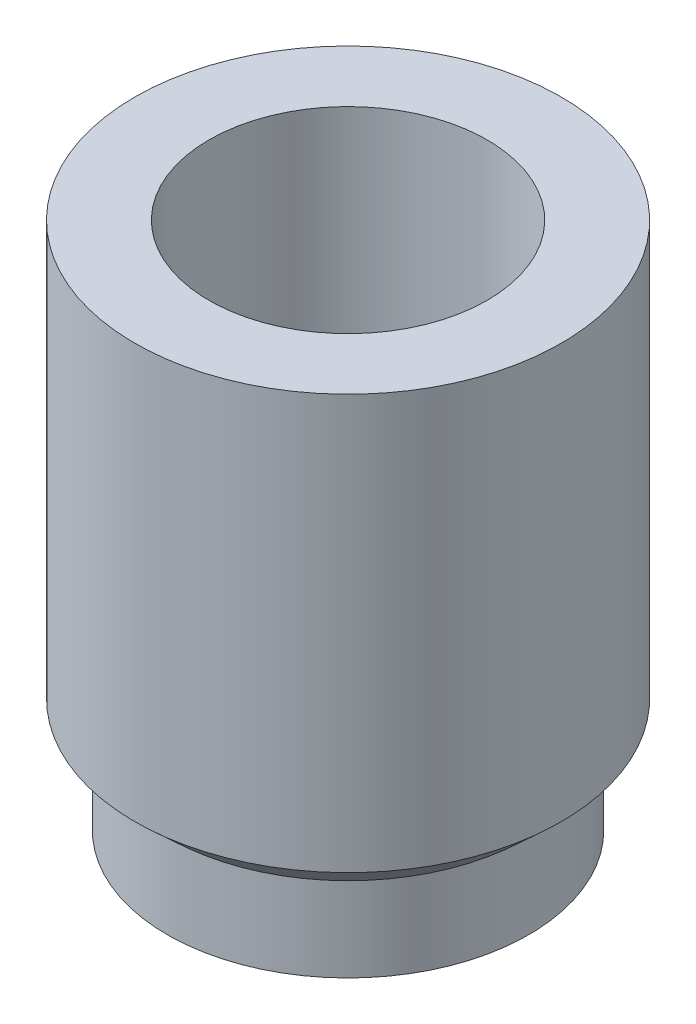
ISO-10303-21;
HEADER;
FILE_DESCRIPTION(('STEP AP214'),'2;1');
FILE_NAME('part.step','',(''),(''),'','','');
FILE_SCHEMA(('AUTOMOTIVE_DESIGN { 1 0 10303 214 1 1 1 1 }'));
ENDSEC;
DATA;
#1=APPLICATION_CONTEXT('core data for automotive mechanical design processes');
#2=APPLICATION_PROTOCOL_DEFINITION('international standard','automotive_design',2000,#1);
#3=PRODUCT_CONTEXT('',#1,'mechanical');
#4=PRODUCT('Part','Part','',(#3));
#5=PRODUCT_RELATED_PRODUCT_CATEGORY('part','',(#4));
#6=PRODUCT_DEFINITION_FORMATION('','',#4);
#7=PRODUCT_DEFINITION_CONTEXT('part definition',#1,'design');
#8=PRODUCT_DEFINITION('design','',#6,#7);
#9=PRODUCT_DEFINITION_SHAPE('','',#8);
#10=(LENGTH_UNIT() NAMED_UNIT(*) SI_UNIT(.MILLI.,.METRE.));
#11=(NAMED_UNIT(*) PLANE_ANGLE_UNIT() SI_UNIT($,.RADIAN.));
#12=(NAMED_UNIT(*) SI_UNIT($,.STERADIAN.) SOLID_ANGLE_UNIT());
#13=UNCERTAINTY_MEASURE_WITH_UNIT(LENGTH_MEASURE(1.E-05),#10,'distance_accuracy_value','');
#14=(GEOMETRIC_REPRESENTATION_CONTEXT(3) GLOBAL_UNCERTAINTY_ASSIGNED_CONTEXT((#13)) GLOBAL_UNIT_ASSIGNED_CONTEXT((#10,
#11,#12)) REPRESENTATION_CONTEXT('',''));
#15=CARTESIAN_POINT('',(0.,0.,0.));
#16=DIRECTION('',(0.,0.,1.));
#17=DIRECTION('',(1.,0.,0.));
#18=AXIS2_PLACEMENT_3D('',#15,#16,#17);
#19=CARTESIAN_POINT('',(0.,0.,0.));
#20=DIRECTION('',(0.,1.,0.));
#21=DIRECTION('',(-1.,0.,0.));
#22=AXIS2_PLACEMENT_3D('',#19,#20,#21);
#23=PLANE('',#22);
#24=CARTESIAN_POINT('',(0.,0.,0.));
#25=DIRECTION('',(0.,1.,0.));
#26=DIRECTION('',(-1.,0.,0.));
#27=AXIS2_PLACEMENT_3D('',#24,#25,#26);
#28=CIRCLE('',#27,1.5);
#29=CARTESIAN_POINT('',(-1.5,0.,0.));
#30=VERTEX_POINT('',#29);
#31=EDGE_CURVE('E53',#30,#30,#28,.T.);
#32=ORIENTED_EDGE('',*,*,#31,.T.);
#33=EDGE_LOOP('',(#32));
#34=FACE_BOUND('',#33,.T.);
#35=CARTESIAN_POINT('',(0.,0.,0.));
#36=DIRECTION('',(0.,1.,0.));
#37=DIRECTION('',(-1.,0.,0.));
#38=AXIS2_PLACEMENT_3D('',#35,#36,#37);
#39=CIRCLE('',#38,1.95);
#40=CARTESIAN_POINT('',(-1.95,0.,0.));
#41=VERTEX_POINT('',#40);
#42=EDGE_CURVE('E10',#41,#41,#39,.T.);
#43=ORIENTED_EDGE('',*,*,#42,.F.);
#44=EDGE_LOOP('',(#43));
#45=FACE_BOUND('',#44,.T.);
#46=ADVANCED_FACE('F34',(#34,#45),#23,.F.);
#47=CARTESIAN_POINT('',(0.,5.7,0.));
#48=DIRECTION('',(0.,1.,0.));
#49=DIRECTION('',(-1.,0.,0.));
#50=AXIS2_PLACEMENT_3D('',#47,#48,#49);
#51=CYLINDRICAL_SURFACE('',#50,1.95);
#52=CARTESIAN_POINT('',(0.,0.908268309918314,0.));
#53=DIRECTION('',(0.,1.,0.));
#54=DIRECTION('',(-1.,0.,0.));
#55=AXIS2_PLACEMENT_3D('',#52,#53,#54);
#56=CIRCLE('',#55,1.95);
#57=CARTESIAN_POINT('',(-1.95,0.908268309918314,0.));
#58=VERTEX_POINT('',#57);
#59=EDGE_CURVE('E41',#58,#58,#56,.T.);
#60=ORIENTED_EDGE('',*,*,#59,.F.);
#61=EDGE_LOOP('',(#60));
#62=FACE_BOUND('',#61,.T.);
#63=ORIENTED_EDGE('',*,*,#42,.T.);
#64=EDGE_LOOP('',(#63));
#65=FACE_BOUND('',#64,.T.);
#66=ADVANCED_FACE('F73',(#62,#65),#51,.T.);
#67=CARTESIAN_POINT('',(0.,0.908268309918314,0.));
#68=DIRECTION('',(0.,1.,0.));
#69=DIRECTION('',(-1.,0.,0.));
#70=AXIS2_PLACEMENT_3D('',#67,#68,#69);
#71=CONICAL_SURFACE('',#70,1.95,0.825380253493447);
#72=CARTESIAN_POINT('',(0.,1.23134302711069,0.));
#73=DIRECTION('',(0.,1.,0.));
#74=DIRECTION('',(-1.,0.,0.));
#75=AXIS2_PLACEMENT_3D('',#72,#73,#74);
#76=CIRCLE('',#75,2.3);
#77=CARTESIAN_POINT('',(-2.3,1.23134302711069,0.));
#78=VERTEX_POINT('',#77);
#79=EDGE_CURVE('E45',#78,#78,#76,.T.);
#80=ORIENTED_EDGE('',*,*,#79,.F.);
#81=EDGE_LOOP('',(#80));
#82=FACE_BOUND('',#81,.T.);
#83=ORIENTED_EDGE('',*,*,#59,.T.);
#84=EDGE_LOOP('',(#83));
#85=FACE_BOUND('',#84,.T.);
#86=ADVANCED_FACE('F77',(#82,#85),#71,.T.);
#87=CARTESIAN_POINT('',(0.,5.7,0.));
#88=DIRECTION('',(0.,1.,0.));
#89=DIRECTION('',(-1.,0.,0.));
#90=AXIS2_PLACEMENT_3D('',#87,#88,#89);
#91=CYLINDRICAL_SURFACE('',#90,2.3);
#92=CARTESIAN_POINT('',(0.,5.7,0.));
#93=DIRECTION('',(0.,1.,0.));
#94=DIRECTION('',(-1.,0.,0.));
#95=AXIS2_PLACEMENT_3D('',#92,#93,#94);
#96=CIRCLE('',#95,2.3);
#97=CARTESIAN_POINT('',(-2.3,5.7,0.));
#98=VERTEX_POINT('',#97);
#99=EDGE_CURVE('E50',#98,#98,#96,.T.);
#100=ORIENTED_EDGE('',*,*,#99,.F.);
#101=EDGE_LOOP('',(#100));
#102=FACE_BOUND('',#101,.T.);
#103=ORIENTED_EDGE('',*,*,#79,.T.);
#104=EDGE_LOOP('',(#103));
#105=FACE_BOUND('',#104,.T.);
#106=ADVANCED_FACE('F70',(#102,#105),#91,.T.);
#107=CARTESIAN_POINT('',(2.3,5.7,0.));
#108=DIRECTION('',(0.,-1.,0.));
#109=DIRECTION('',(1.,0.,0.));
#110=AXIS2_PLACEMENT_3D('',#107,#108,#109);
#111=PLANE('',#110);
#112=CARTESIAN_POINT('',(0.,5.7,0.));
#113=DIRECTION('',(0.,-1.,0.));
#114=DIRECTION('',(1.,0.,0.));
#115=AXIS2_PLACEMENT_3D('',#112,#113,#114);
#116=CIRCLE('',#115,1.5);
#117=CARTESIAN_POINT('',(1.5,5.7,0.));
#118=VERTEX_POINT('',#117);
#119=EDGE_CURVE('E37',#118,#118,#116,.T.);
#120=ORIENTED_EDGE('',*,*,#119,.T.);
#121=EDGE_LOOP('',(#120));
#122=FACE_BOUND('',#121,.T.);
#123=ORIENTED_EDGE('',*,*,#99,.T.);
#124=EDGE_LOOP('',(#123));
#125=FACE_BOUND('',#124,.T.);
#126=ADVANCED_FACE('F60',(#122,#125),#111,.F.);
#127=CARTESIAN_POINT('',(0.,0.,0.));
#128=DIRECTION('',(0.,1.,0.));
#129=DIRECTION('',(-1.,0.,0.));
#130=AXIS2_PLACEMENT_3D('',#127,#128,#129);
#131=CYLINDRICAL_SURFACE('',#130,1.5);
#132=ORIENTED_EDGE('',*,*,#31,.F.);
#133=EDGE_LOOP('',(#132));
#134=FACE_BOUND('',#133,.T.);
#135=ORIENTED_EDGE('',*,*,#119,.F.);
#136=EDGE_LOOP('',(#135));
#137=FACE_BOUND('',#136,.T.);
#138=ADVANCED_FACE('F63',(#134,#137),#131,.F.);
#139=CLOSED_SHELL('',(#46,#66,#86,#106,#126,#138));
#140=MANIFOLD_SOLID_BREP('B2',#139);
#141=ADVANCED_BREP_SHAPE_REPRESENTATION('',(#18,#140),#14);
#142=SHAPE_DEFINITION_REPRESENTATION(#9,#141);
ENDSEC;
END-ISO-10303-21;
